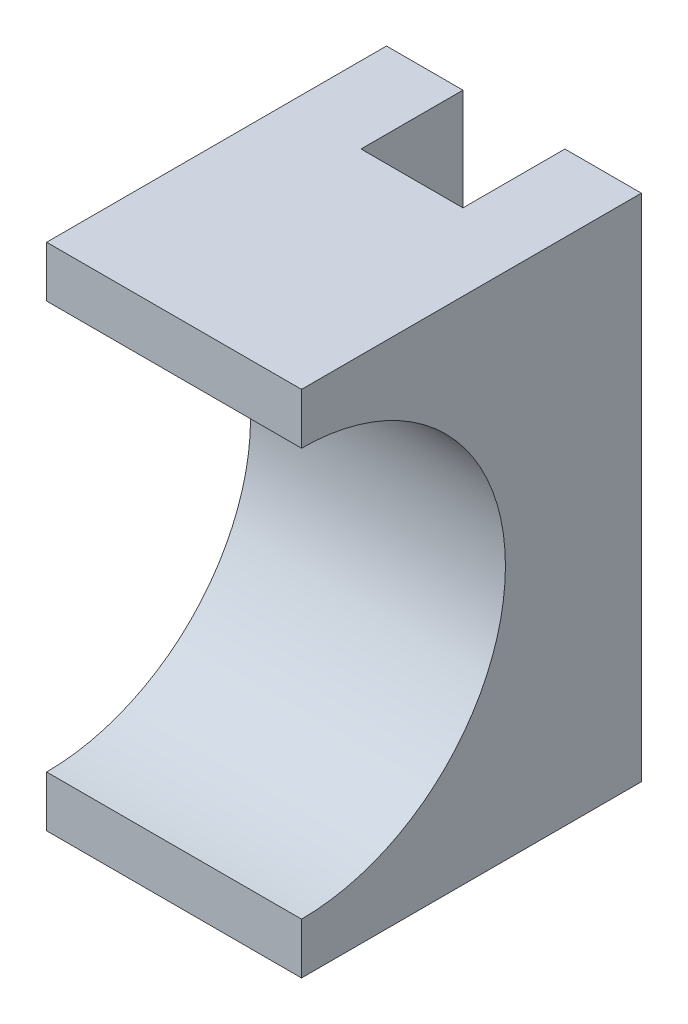
ISO-10303-21;
HEADER;
FILE_DESCRIPTION(('STEP AP214'),'2;1');
FILE_NAME('part.step','',(''),(''),'','','');
FILE_SCHEMA(('AUTOMOTIVE_DESIGN { 1 0 10303 214 1 1 1 1 }'));
ENDSEC;
DATA;
#1=APPLICATION_CONTEXT('core data for automotive mechanical design processes');
#2=APPLICATION_PROTOCOL_DEFINITION('international standard','automotive_design',2000,#1);
#3=PRODUCT_CONTEXT('',#1,'mechanical');
#4=PRODUCT('Part','Part','',(#3));
#5=PRODUCT_RELATED_PRODUCT_CATEGORY('part','',(#4));
#6=PRODUCT_DEFINITION_FORMATION('','',#4);
#7=PRODUCT_DEFINITION_CONTEXT('part definition',#1,'design');
#8=PRODUCT_DEFINITION('design','',#6,#7);
#9=PRODUCT_DEFINITION_SHAPE('','',#8);
#10=(LENGTH_UNIT() NAMED_UNIT(*) SI_UNIT(.MILLI.,.METRE.));
#11=(NAMED_UNIT(*) PLANE_ANGLE_UNIT() SI_UNIT($,.RADIAN.));
#12=(NAMED_UNIT(*) SI_UNIT($,.STERADIAN.) SOLID_ANGLE_UNIT());
#13=UNCERTAINTY_MEASURE_WITH_UNIT(LENGTH_MEASURE(1.E-05),#10,'distance_accuracy_value','');
#14=(GEOMETRIC_REPRESENTATION_CONTEXT(3) GLOBAL_UNCERTAINTY_ASSIGNED_CONTEXT((#13)) GLOBAL_UNIT_ASSIGNED_CONTEXT((#10,
#11,#12)) REPRESENTATION_CONTEXT('',''));
#15=CARTESIAN_POINT('',(0.,0.,0.));
#16=DIRECTION('',(0.,0.,1.));
#17=DIRECTION('',(1.,0.,0.));
#18=AXIS2_PLACEMENT_3D('',#15,#16,#17);
#19=CARTESIAN_POINT('',(-7.5,30.,10.));
#20=DIRECTION('',(0.,0.,-1.));
#21=DIRECTION('',(-1.,0.,0.));
#22=AXIS2_PLACEMENT_3D('',#19,#20,#21);
#23=PLANE('',#22);
#24=DIRECTION('',(0.,-1.,0.));
#25=VECTOR('',#24,1.);
#26=CARTESIAN_POINT('',(-7.5,30.,10.));
#27=LINE('',#26,#25);
#28=CARTESIAN_POINT('',(-7.5,30.,10.));
#29=VERTEX_POINT('',#28);
#30=CARTESIAN_POINT('',(-7.5,27.,10.));
#31=VERTEX_POINT('',#30);
#32=EDGE_CURVE('E11',#29,#31,#27,.T.);
#33=ORIENTED_EDGE('',*,*,#32,.T.);
#34=DIRECTION('',(1.,0.,0.));
#35=VECTOR('',#34,1.);
#36=CARTESIAN_POINT('',(-7.501,27.,10.));
#37=LINE('',#36,#35);
#38=CARTESIAN_POINT('',(7.5,27.,10.));
#39=VERTEX_POINT('',#38);
#40=EDGE_CURVE('E155',#31,#39,#37,.T.);
#41=ORIENTED_EDGE('',*,*,#40,.T.);
#42=DIRECTION('',(0.,-1.,0.));
#43=VECTOR('',#42,1.);
#44=CARTESIAN_POINT('',(7.5,30.,10.));
#45=LINE('',#44,#43);
#46=CARTESIAN_POINT('',(7.5,30.,10.));
#47=VERTEX_POINT('',#46);
#48=EDGE_CURVE('E185',#47,#39,#45,.T.);
#49=ORIENTED_EDGE('',*,*,#48,.F.);
#50=DIRECTION('',(1.,0.,0.));
#51=VECTOR('',#50,1.);
#52=CARTESIAN_POINT('',(-7.5,30.,10.));
#53=LINE('',#52,#51);
#54=EDGE_CURVE('E163',#29,#47,#53,.T.);
#55=ORIENTED_EDGE('',*,*,#54,.F.);
#56=EDGE_LOOP('',(#33,#41,#49,#55));
#57=FACE_BOUND('',#56,.T.);
#58=ADVANCED_FACE('F33',(#57),#23,.F.);
#59=CARTESIAN_POINT('',(-7.5,30.,-10.));
#60=DIRECTION('',(1.,0.,0.));
#61=DIRECTION('',(0.,0.,-1.));
#62=AXIS2_PLACEMENT_3D('',#59,#60,#61);
#63=PLANE('',#62);
#64=CARTESIAN_POINT('',(-7.5,3.,10.));
#65=VERTEX_POINT('',#64);
#66=CARTESIAN_POINT('',(-7.5,0.,10.));
#67=VERTEX_POINT('',#66);
#68=EDGE_CURVE('E41',#65,#67,#27,.T.);
#69=ORIENTED_EDGE('',*,*,#68,.F.);
#70=CARTESIAN_POINT('',(-7.5,15.,10.));
#71=DIRECTION('',(1.,0.,0.));
#72=DIRECTION('',(0.,0.,-1.));
#73=AXIS2_PLACEMENT_3D('',#70,#71,#72);
#74=CIRCLE('',#73,12.);
#75=EDGE_CURVE('E148',#31,#65,#74,.F.);
#76=ORIENTED_EDGE('',*,*,#75,.F.);
#77=ORIENTED_EDGE('',*,*,#32,.F.);
#78=DIRECTION('',(0.,0.,1.));
#79=VECTOR('',#78,1.);
#80=CARTESIAN_POINT('',(-7.5,30.,-10.));
#81=LINE('',#80,#79);
#82=CARTESIAN_POINT('',(-7.5,30.,-10.));
#83=VERTEX_POINT('',#82);
#84=EDGE_CURVE('E160',#83,#29,#81,.T.);
#85=ORIENTED_EDGE('',*,*,#84,.F.);
#86=DIRECTION('',(0.,-1.,0.));
#87=VECTOR('',#86,1.);
#88=CARTESIAN_POINT('',(-7.5,30.,-10.));
#89=LINE('',#88,#87);
#90=CARTESIAN_POINT('',(-7.5,0.,-10.));
#91=VERTEX_POINT('',#90);
#92=EDGE_CURVE('E171',#83,#91,#89,.T.);
#93=ORIENTED_EDGE('',*,*,#92,.T.);
#94=DIRECTION('',(0.,0.,1.));
#95=VECTOR('',#94,1.);
#96=CARTESIAN_POINT('',(-7.5,0.,-10.));
#97=LINE('',#96,#95);
#98=EDGE_CURVE('E157',#91,#67,#97,.T.);
#99=ORIENTED_EDGE('',*,*,#98,.T.);
#100=EDGE_LOOP('',(#69,#76,#77,#85,#93,#99));
#101=FACE_BOUND('',#100,.T.);
#102=ADVANCED_FACE('F35',(#101),#63,.F.);
#103=CARTESIAN_POINT('',(7.5,3.,10.));
#104=VERTEX_POINT('',#103);
#105=CARTESIAN_POINT('',(7.5,0.,10.));
#106=VERTEX_POINT('',#105);
#107=EDGE_CURVE('E184',#104,#106,#45,.T.);
#108=ORIENTED_EDGE('',*,*,#107,.F.);
#109=DIRECTION('',(1.,0.,0.));
#110=VECTOR('',#109,1.);
#111=CARTESIAN_POINT('',(-7.501,3.,10.));
#112=LINE('',#111,#110);
#113=EDGE_CURVE('E56',#65,#104,#112,.T.);
#114=ORIENTED_EDGE('',*,*,#113,.F.);
#115=ORIENTED_EDGE('',*,*,#68,.T.);
#116=DIRECTION('',(1.,0.,0.));
#117=VECTOR('',#116,1.);
#118=CARTESIAN_POINT('',(-7.5,0.,10.));
#119=LINE('',#118,#117);
#120=EDGE_CURVE('E174',#67,#106,#119,.T.);
#121=ORIENTED_EDGE('',*,*,#120,.T.);
#122=EDGE_LOOP('',(#108,#114,#115,#121));
#123=FACE_BOUND('',#122,.T.);
#124=ADVANCED_FACE('F196',(#123),#23,.F.);
#125=CARTESIAN_POINT('',(7.5,30.,-10.));
#126=DIRECTION('',(-1.,0.,0.));
#127=DIRECTION('',(0.,0.,1.));
#128=AXIS2_PLACEMENT_3D('',#125,#126,#127);
#129=PLANE('',#128);
#130=ORIENTED_EDGE('',*,*,#48,.T.);
#131=CARTESIAN_POINT('',(7.5,15.,10.));
#132=DIRECTION('',(1.,0.,0.));
#133=DIRECTION('',(0.,0.,1.));
#134=AXIS2_PLACEMENT_3D('',#131,#132,#133);
#135=CIRCLE('',#134,12.);
#136=EDGE_CURVE('E153',#104,#39,#135,.T.);
#137=ORIENTED_EDGE('',*,*,#136,.F.);
#138=ORIENTED_EDGE('',*,*,#107,.T.);
#139=DIRECTION('',(0.,0.,-1.));
#140=VECTOR('',#139,1.);
#141=CARTESIAN_POINT('',(7.5,0.,-10.));
#142=LINE('',#141,#140);
#143=CARTESIAN_POINT('',(7.5,0.,-10.));
#144=VERTEX_POINT('',#143);
#145=EDGE_CURVE('E177',#106,#144,#142,.T.);
#146=ORIENTED_EDGE('',*,*,#145,.T.);
#147=DIRECTION('',(0.,-1.,0.));
#148=VECTOR('',#147,1.);
#149=CARTESIAN_POINT('',(7.5,30.,-10.));
#150=LINE('',#149,#148);
#151=CARTESIAN_POINT('',(7.5,30.,-10.));
#152=VERTEX_POINT('',#151);
#153=EDGE_CURVE('E182',#152,#144,#150,.T.);
#154=ORIENTED_EDGE('',*,*,#153,.F.);
#155=DIRECTION('',(0.,0.,-1.));
#156=VECTOR('',#155,1.);
#157=CARTESIAN_POINT('',(7.5,30.,-10.));
#158=LINE('',#157,#156);
#159=EDGE_CURVE('E166',#47,#152,#158,.T.);
#160=ORIENTED_EDGE('',*,*,#159,.F.);
#161=EDGE_LOOP('',(#130,#137,#138,#146,#154,#160));
#162=FACE_BOUND('',#161,.T.);
#163=ADVANCED_FACE('F191',(#162),#129,.F.);
#164=CARTESIAN_POINT('',(-7.5,30.,-10.));
#165=DIRECTION('',(0.,0.,1.));
#166=DIRECTION('',(1.,0.,0.));
#167=AXIS2_PLACEMENT_3D('',#164,#165,#166);
#168=PLANE('',#167);
#169=DIRECTION('',(-1.,0.,0.));
#170=VECTOR('',#169,1.);
#171=CARTESIAN_POINT('',(3.,5.,-10.));
#172=LINE('',#171,#170);
#173=CARTESIAN_POINT('',(3.,5.,-10.));
#174=VERTEX_POINT('',#173);
#175=CARTESIAN_POINT('',(-3.,5.,-10.));
#176=VERTEX_POINT('',#175);
#177=EDGE_CURVE('E128',#174,#176,#172,.T.);
#178=ORIENTED_EDGE('',*,*,#177,.F.);
#179=DIRECTION('',(0.,1.,0.));
#180=VECTOR('',#179,1.);
#181=CARTESIAN_POINT('',(3.,5.,-10.));
#182=LINE('',#181,#180);
#183=CARTESIAN_POINT('',(3.,30.,-10.));
#184=VERTEX_POINT('',#183);
#185=EDGE_CURVE('E111',#174,#184,#182,.T.);
#186=ORIENTED_EDGE('',*,*,#185,.T.);
#187=DIRECTION('',(-1.,0.,0.));
#188=VECTOR('',#187,1.);
#189=CARTESIAN_POINT('',(-7.5,30.,-10.));
#190=LINE('',#189,#188);
#191=EDGE_CURVE('E169',#152,#184,#190,.T.);
#192=ORIENTED_EDGE('',*,*,#191,.F.);
#193=ORIENTED_EDGE('',*,*,#153,.T.);
#194=DIRECTION('',(-1.,0.,0.));
#195=VECTOR('',#194,1.);
#196=CARTESIAN_POINT('',(-7.5,0.,-10.));
#197=LINE('',#196,#195);
#198=EDGE_CURVE('E164',#144,#91,#197,.T.);
#199=ORIENTED_EDGE('',*,*,#198,.T.);
#200=ORIENTED_EDGE('',*,*,#92,.F.);
#201=CARTESIAN_POINT('',(-3.,30.,-10.));
#202=VERTEX_POINT('',#201);
#203=EDGE_CURVE('E168',#202,#83,#190,.T.);
#204=ORIENTED_EDGE('',*,*,#203,.F.);
#205=DIRECTION('',(0.,1.,0.));
#206=VECTOR('',#205,1.);
#207=CARTESIAN_POINT('',(-3.,5.,-10.));
#208=LINE('',#207,#206);
#209=EDGE_CURVE('E48',#176,#202,#208,.T.);
#210=ORIENTED_EDGE('',*,*,#209,.F.);
#211=EDGE_LOOP('',(#178,#186,#192,#193,#199,#200,#204,#210));
#212=FACE_BOUND('',#211,.T.);
#213=ADVANCED_FACE('F132',(#212),#168,.F.);
#214=CARTESIAN_POINT('',(0.,30.,0.));
#215=DIRECTION('',(0.,1.,0.));
#216=DIRECTION('',(0.,0.,1.));
#217=AXIS2_PLACEMENT_3D('',#214,#215,#216);
#218=PLANE('',#217);
#219=DIRECTION('',(0.,0.,-1.));
#220=VECTOR('',#219,1.);
#221=CARTESIAN_POINT('',(3.,30.,-10.));
#222=LINE('',#221,#220);
#223=CARTESIAN_POINT('',(3.,30.,-4.));
#224=VERTEX_POINT('',#223);
#225=EDGE_CURVE('E117',#224,#184,#222,.T.);
#226=ORIENTED_EDGE('',*,*,#225,.F.);
#227=DIRECTION('',(1.,0.,0.));
#228=VECTOR('',#227,1.);
#229=CARTESIAN_POINT('',(3.,30.,-4.));
#230=LINE('',#229,#228);
#231=CARTESIAN_POINT('',(-3.,30.,-4.));
#232=VERTEX_POINT('',#231);
#233=EDGE_CURVE('E130',#232,#224,#230,.T.);
#234=ORIENTED_EDGE('',*,*,#233,.F.);
#235=DIRECTION('',(0.,0.,1.));
#236=VECTOR('',#235,1.);
#237=CARTESIAN_POINT('',(-3.,30.,-10.));
#238=LINE('',#237,#236);
#239=EDGE_CURVE('E141',#202,#232,#238,.T.);
#240=ORIENTED_EDGE('',*,*,#239,.F.);
#241=ORIENTED_EDGE('',*,*,#203,.T.);
#242=ORIENTED_EDGE('',*,*,#84,.T.);
#243=ORIENTED_EDGE('',*,*,#54,.T.);
#244=ORIENTED_EDGE('',*,*,#159,.T.);
#245=ORIENTED_EDGE('',*,*,#191,.T.);
#246=EDGE_LOOP('',(#226,#234,#240,#241,#242,#243,#244,#245));
#247=FACE_BOUND('',#246,.T.);
#248=ADVANCED_FACE('F208',(#247),#218,.T.);
#249=CARTESIAN_POINT('',(0.,0.,0.));
#250=DIRECTION('',(0.,1.,0.));
#251=DIRECTION('',(0.,0.,1.));
#252=AXIS2_PLACEMENT_3D('',#249,#250,#251);
#253=PLANE('',#252);
#254=CARTESIAN_POINT('',(0.,0.,-7.));
#255=DIRECTION('',(0.,1.,0.));
#256=DIRECTION('',(0.,0.,1.));
#257=AXIS2_PLACEMENT_3D('',#254,#255,#256);
#258=CIRCLE('',#257,1.1);
#259=CARTESIAN_POINT('',(0.,0.,-5.9));
#260=VERTEX_POINT('',#259);
#261=EDGE_CURVE('E142',#260,#260,#258,.F.);
#262=ORIENTED_EDGE('',*,*,#261,.F.);
#263=EDGE_LOOP('',(#262));
#264=FACE_BOUND('',#263,.T.);
#265=ORIENTED_EDGE('',*,*,#98,.F.);
#266=ORIENTED_EDGE('',*,*,#198,.F.);
#267=ORIENTED_EDGE('',*,*,#145,.F.);
#268=ORIENTED_EDGE('',*,*,#120,.F.);
#269=EDGE_LOOP('',(#265,#266,#267,#268));
#270=FACE_BOUND('',#269,.T.);
#271=ADVANCED_FACE('F201',(#264,#270),#253,.F.);
#272=CARTESIAN_POINT('',(-7.501,15.,10.));
#273=DIRECTION('',(1.,0.,0.));
#274=DIRECTION('',(0.,0.,-1.));
#275=AXIS2_PLACEMENT_3D('',#272,#273,#274);
#276=CYLINDRICAL_SURFACE('',#275,12.);
#277=ORIENTED_EDGE('',*,*,#75,.T.);
#278=ORIENTED_EDGE('',*,*,#113,.T.);
#279=ORIENTED_EDGE('',*,*,#136,.T.);
#280=ORIENTED_EDGE('',*,*,#40,.F.);
#281=EDGE_LOOP('',(#277,#278,#279,#280));
#282=FACE_BOUND('',#281,.T.);
#283=ADVANCED_FACE('F220',(#282),#276,.F.);
#284=CARTESIAN_POINT('',(3.,5.,-10.));
#285=DIRECTION('',(1.,0.,0.));
#286=DIRECTION('',(0.,0.,-1.));
#287=AXIS2_PLACEMENT_3D('',#284,#285,#286);
#288=PLANE('',#287);
#289=ORIENTED_EDGE('',*,*,#225,.T.);
#290=ORIENTED_EDGE('',*,*,#185,.F.);
#291=DIRECTION('',(0.,0.,-1.));
#292=VECTOR('',#291,1.);
#293=CARTESIAN_POINT('',(3.,5.,-10.));
#294=LINE('',#293,#292);
#295=CARTESIAN_POINT('',(3.,5.,-4.));
#296=VERTEX_POINT('',#295);
#297=EDGE_CURVE('E114',#296,#174,#294,.T.);
#298=ORIENTED_EDGE('',*,*,#297,.F.);
#299=DIRECTION('',(0.,1.,0.));
#300=VECTOR('',#299,1.);
#301=CARTESIAN_POINT('',(3.,5.,-4.));
#302=LINE('',#301,#300);
#303=EDGE_CURVE('E146',#296,#224,#302,.T.);
#304=ORIENTED_EDGE('',*,*,#303,.T.);
#305=EDGE_LOOP('',(#289,#290,#298,#304));
#306=FACE_BOUND('',#305,.T.);
#307=ADVANCED_FACE('F113',(#306),#288,.F.);
#308=CARTESIAN_POINT('',(3.,5.,-4.));
#309=DIRECTION('',(0.,0.,1.));
#310=DIRECTION('',(1.,0.,0.));
#311=AXIS2_PLACEMENT_3D('',#308,#309,#310);
#312=PLANE('',#311);
#313=ORIENTED_EDGE('',*,*,#233,.T.);
#314=ORIENTED_EDGE('',*,*,#303,.F.);
#315=DIRECTION('',(1.,0.,0.));
#316=VECTOR('',#315,1.);
#317=CARTESIAN_POINT('',(3.,5.,-4.));
#318=LINE('',#317,#316);
#319=CARTESIAN_POINT('',(-3.,5.,-4.));
#320=VERTEX_POINT('',#319);
#321=EDGE_CURVE('E122',#320,#296,#318,.T.);
#322=ORIENTED_EDGE('',*,*,#321,.F.);
#323=DIRECTION('',(0.,1.,0.));
#324=VECTOR('',#323,1.);
#325=CARTESIAN_POINT('',(-3.,5.,-4.));
#326=LINE('',#325,#324);
#327=EDGE_CURVE('E149',#320,#232,#326,.T.);
#328=ORIENTED_EDGE('',*,*,#327,.T.);
#329=EDGE_LOOP('',(#313,#314,#322,#328));
#330=FACE_BOUND('',#329,.T.);
#331=ADVANCED_FACE('F212',(#330),#312,.F.);
#332=CARTESIAN_POINT('',(-3.,5.,-10.));
#333=DIRECTION('',(-1.,0.,0.));
#334=DIRECTION('',(0.,0.,1.));
#335=AXIS2_PLACEMENT_3D('',#332,#333,#334);
#336=PLANE('',#335);
#337=ORIENTED_EDGE('',*,*,#239,.T.);
#338=ORIENTED_EDGE('',*,*,#327,.F.);
#339=DIRECTION('',(0.,0.,1.));
#340=VECTOR('',#339,1.);
#341=CARTESIAN_POINT('',(-3.,5.,-10.));
#342=LINE('',#341,#340);
#343=EDGE_CURVE('E134',#176,#320,#342,.T.);
#344=ORIENTED_EDGE('',*,*,#343,.F.);
#345=ORIENTED_EDGE('',*,*,#209,.T.);
#346=EDGE_LOOP('',(#337,#338,#344,#345));
#347=FACE_BOUND('',#346,.T.);
#348=ADVANCED_FACE('F210',(#347),#336,.F.);
#349=CARTESIAN_POINT('',(0.,5.,0.));
#350=DIRECTION('',(0.,-1.,0.));
#351=DIRECTION('',(0.,0.,-1.));
#352=AXIS2_PLACEMENT_3D('',#349,#350,#351);
#353=PLANE('',#352);
#354=CARTESIAN_POINT('',(0.,5.,-7.));
#355=DIRECTION('',(0.,-1.,0.));
#356=DIRECTION('',(0.,0.,-1.));
#357=AXIS2_PLACEMENT_3D('',#354,#355,#356);
#358=CIRCLE('',#357,1.1);
#359=CARTESIAN_POINT('',(0.,5.,-8.1));
#360=VERTEX_POINT('',#359);
#361=EDGE_CURVE('E296',#360,#360,#358,.F.);
#362=ORIENTED_EDGE('',*,*,#361,.F.);
#363=EDGE_LOOP('',(#362));
#364=FACE_BOUND('',#363,.T.);
#365=ORIENTED_EDGE('',*,*,#297,.T.);
#366=ORIENTED_EDGE('',*,*,#177,.T.);
#367=ORIENTED_EDGE('',*,*,#343,.T.);
#368=ORIENTED_EDGE('',*,*,#321,.T.);
#369=EDGE_LOOP('',(#365,#366,#367,#368));
#370=FACE_BOUND('',#369,.T.);
#371=ADVANCED_FACE('F126',(#364,#370),#353,.F.);
#372=CARTESIAN_POINT('',(0.,-0.001000000000001,-7.));
#373=DIRECTION('',(0.,1.,0.));
#374=DIRECTION('',(0.,0.,1.));
#375=AXIS2_PLACEMENT_3D('',#372,#373,#374);
#376=CYLINDRICAL_SURFACE('',#375,1.1);
#377=ORIENTED_EDGE('',*,*,#361,.T.);
#378=EDGE_LOOP('',(#377));
#379=FACE_BOUND('',#378,.T.);
#380=ORIENTED_EDGE('',*,*,#261,.T.);
#381=EDGE_LOOP('',(#380));
#382=FACE_BOUND('',#381,.T.);
#383=ADVANCED_FACE('F280',(#379,#382),#376,.F.);
#384=CLOSED_SHELL('',(#58,#102,#124,#163,#213,#248,#271,#283,#307,#331,#348,#371,#383));
#385=MANIFOLD_SOLID_BREP('B2',#384);
#386=ADVANCED_BREP_SHAPE_REPRESENTATION('',(#18,#385),#14);
#387=SHAPE_DEFINITION_REPRESENTATION(#9,#386);
ENDSEC;
END-ISO-10303-21;
